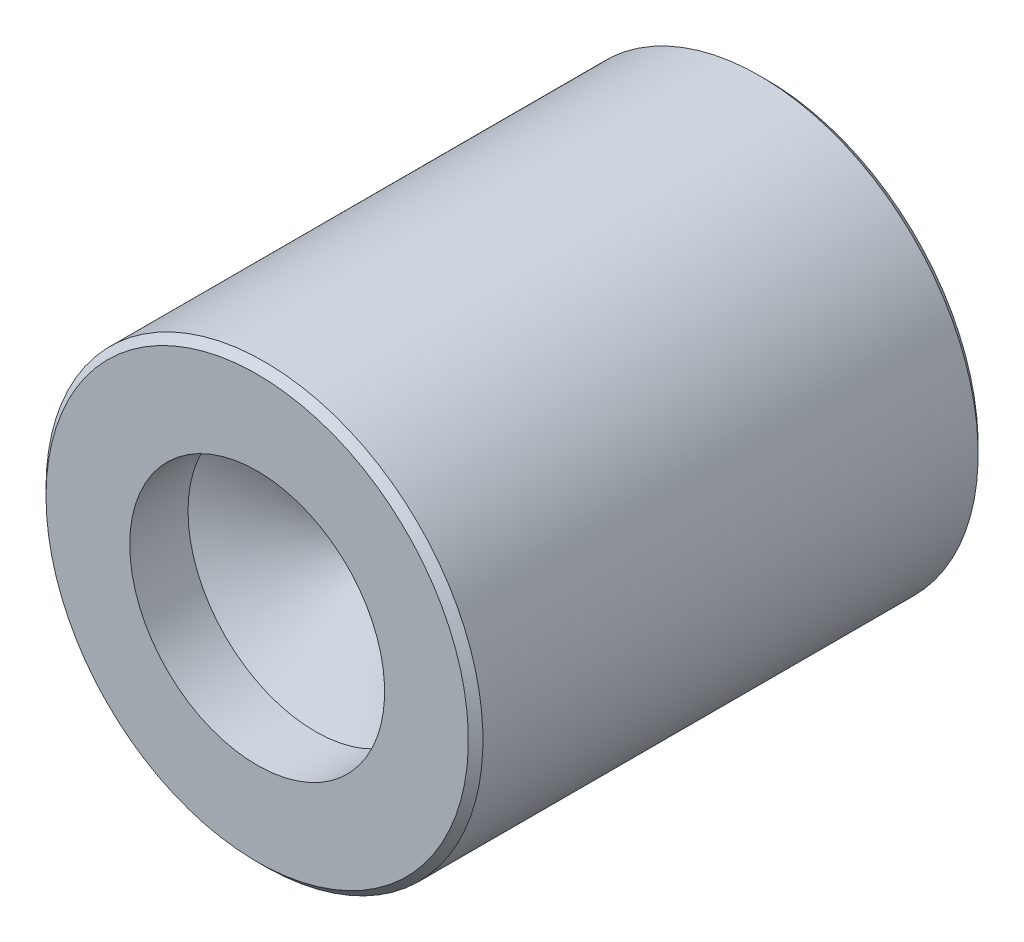
ISO-10303-21;
HEADER;
FILE_DESCRIPTION(('STEP AP214'),'2;1');
FILE_NAME('part.step','',(''),(''),'','','');
FILE_SCHEMA(('AUTOMOTIVE_DESIGN { 1 0 10303 214 1 1 1 1 }'));
ENDSEC;
DATA;
#1=APPLICATION_CONTEXT('core data for automotive mechanical design processes');
#2=APPLICATION_PROTOCOL_DEFINITION('international standard','automotive_design',2000,#1);
#3=PRODUCT_CONTEXT('',#1,'mechanical');
#4=PRODUCT('Part','Part','',(#3));
#5=PRODUCT_RELATED_PRODUCT_CATEGORY('part','',(#4));
#6=PRODUCT_DEFINITION_FORMATION('','',#4);
#7=PRODUCT_DEFINITION_CONTEXT('part definition',#1,'design');
#8=PRODUCT_DEFINITION('design','',#6,#7);
#9=PRODUCT_DEFINITION_SHAPE('','',#8);
#10=(LENGTH_UNIT() NAMED_UNIT(*) SI_UNIT(.MILLI.,.METRE.));
#11=(NAMED_UNIT(*) PLANE_ANGLE_UNIT() SI_UNIT($,.RADIAN.));
#12=(NAMED_UNIT(*) SI_UNIT($,.STERADIAN.) SOLID_ANGLE_UNIT());
#13=UNCERTAINTY_MEASURE_WITH_UNIT(LENGTH_MEASURE(1.E-05),#10,'distance_accuracy_value','');
#14=(GEOMETRIC_REPRESENTATION_CONTEXT(3) GLOBAL_UNCERTAINTY_ASSIGNED_CONTEXT((#13)) GLOBAL_UNIT_ASSIGNED_CONTEXT((#10,
#11,#12)) REPRESENTATION_CONTEXT('',''));
#15=CARTESIAN_POINT('',(0.,0.,0.));
#16=DIRECTION('',(0.,0.,1.));
#17=DIRECTION('',(1.,0.,0.));
#18=AXIS2_PLACEMENT_3D('',#15,#16,#17);
#19=CARTESIAN_POINT('',(0.,0.,67.0833333333376));
#20=DIRECTION('',(0.,0.,-1.));
#21=DIRECTION('',(-1.,0.,0.));
#22=AXIS2_PLACEMENT_3D('',#19,#20,#21);
#23=CYLINDRICAL_SURFACE('',#22,16.7708333333344);
#24=CARTESIAN_POINT('',(0.,0.,59.4166666666323));
#25=DIRECTION('',(0.,0.,-1.));
#26=DIRECTION('',(-1.,0.,0.));
#27=AXIS2_PLACEMENT_3D('',#24,#25,#26);
#28=CIRCLE('',#27,16.7708333333344);
#29=CARTESIAN_POINT('',(-16.7708333333344,0.,59.4166666666323));
#30=VERTEX_POINT('',#29);
#31=EDGE_CURVE('E11',#30,#30,#28,.T.);
#32=ORIENTED_EDGE('',*,*,#31,.T.);
#33=EDGE_LOOP('',(#32));
#34=FACE_BOUND('',#33,.T.);
#35=CARTESIAN_POINT('',(0.,0.,67.0833333333394));
#36=DIRECTION('',(0.,0.,-1.));
#37=DIRECTION('',(-1.,0.,0.));
#38=AXIS2_PLACEMENT_3D('',#35,#36,#37);
#39=CIRCLE('',#38,16.7708333333344);
#40=CARTESIAN_POINT('',(-16.7708333333344,0.,67.0833333333394));
#41=VERTEX_POINT('',#40);
#42=EDGE_CURVE('E52',#41,#41,#39,.T.);
#43=ORIENTED_EDGE('',*,*,#42,.F.);
#44=EDGE_LOOP('',(#43));
#45=FACE_BOUND('',#44,.T.);
#46=ADVANCED_FACE('F33',(#34,#45),#23,.F.);
#47=CARTESIAN_POINT('',(0.,0.,59.4166666666323));
#48=DIRECTION('',(0.,0.,1.));
#49=DIRECTION('',(1.,0.,0.));
#50=AXIS2_PLACEMENT_3D('',#47,#48,#49);
#51=CONICAL_SURFACE('',#50,16.7708333333344,1.02974425868);
#52=CARTESIAN_POINT('',(0.,0.,49.3397333684333));
#53=VERTEX_POINT('',#52);
#54=VERTEX_LOOP('',#53);
#55=FACE_BOUND('',#54,.T.);
#56=ORIENTED_EDGE('',*,*,#31,.F.);
#57=EDGE_LOOP('',(#56));
#58=FACE_BOUND('',#57,.T.);
#59=ADVANCED_FACE('F42',(#55,#58),#51,.F.);
#60=CARTESIAN_POINT('',(0.,0.,0.));
#61=DIRECTION('',(0.,0.,-1.));
#62=DIRECTION('',(-1.,0.,0.));
#63=AXIS2_PLACEMENT_3D('',#60,#61,#62);
#64=PLANE('',#63);
#65=CARTESIAN_POINT('',(0.,0.,0.));
#66=DIRECTION('',(0.,0.,-1.));
#67=DIRECTION('',(-1.,0.,0.));
#68=AXIS2_PLACEMENT_3D('',#65,#66,#67);
#69=CIRCLE('',#68,27.7916666666672);
#70=CARTESIAN_POINT('',(-27.7916666666672,0.,0.));
#71=VERTEX_POINT('',#70);
#72=EDGE_CURVE('E39',#71,#71,#69,.T.);
#73=ORIENTED_EDGE('',*,*,#72,.T.);
#74=EDGE_LOOP('',(#73));
#75=FACE_BOUND('',#74,.T.);
#76=ADVANCED_FACE('F45',(#75),#64,.T.);
#77=CARTESIAN_POINT('',(0.,0.,0.));
#78=DIRECTION('',(0.,0.,1.));
#79=DIRECTION('',(1.,0.,0.));
#80=AXIS2_PLACEMENT_3D('',#77,#78,#79);
#81=CONICAL_SURFACE('',#80,27.7916666666672,0.785398163397452);
#82=CARTESIAN_POINT('',(0.,0.,0.95833333333277));
#83=DIRECTION('',(0.,0.,-1.));
#84=DIRECTION('',(-1.,0.,0.));
#85=AXIS2_PLACEMENT_3D('',#82,#83,#84);
#86=CIRCLE('',#85,28.75);
#87=CARTESIAN_POINT('',(-28.75,0.,0.958333333332776));
#88=VERTEX_POINT('',#87);
#89=EDGE_CURVE('E62',#88,#88,#86,.T.);
#90=ORIENTED_EDGE('',*,*,#89,.T.);
#91=EDGE_LOOP('',(#90));
#92=FACE_BOUND('',#91,.T.);
#93=ORIENTED_EDGE('',*,*,#72,.F.);
#94=EDGE_LOOP('',(#93));
#95=FACE_BOUND('',#94,.T.);
#96=ADVANCED_FACE('F68',(#92,#95),#81,.T.);
#97=CARTESIAN_POINT('',(0.,0.,67.0833333333376));
#98=DIRECTION('',(0.,0.,-1.));
#99=DIRECTION('',(-1.,0.,0.));
#100=AXIS2_PLACEMENT_3D('',#97,#98,#99);
#101=CYLINDRICAL_SURFACE('',#100,28.75);
#102=CARTESIAN_POINT('',(0.,0.,66.125000000006));
#103=DIRECTION('',(0.,0.,-1.));
#104=DIRECTION('',(-1.,0.,0.));
#105=AXIS2_PLACEMENT_3D('',#102,#103,#104);
#106=CIRCLE('',#105,28.75);
#107=CARTESIAN_POINT('',(-28.75,0.,66.125000000006));
#108=VERTEX_POINT('',#107);
#109=EDGE_CURVE('E57',#108,#108,#106,.T.);
#110=ORIENTED_EDGE('',*,*,#109,.T.);
#111=EDGE_LOOP('',(#110));
#112=FACE_BOUND('',#111,.T.);
#113=ORIENTED_EDGE('',*,*,#89,.F.);
#114=EDGE_LOOP('',(#113));
#115=FACE_BOUND('',#114,.T.);
#116=ADVANCED_FACE('F70',(#112,#115),#101,.T.);
#117=CARTESIAN_POINT('',(0.,0.,66.125000000006));
#118=DIRECTION('',(0.,0.,-1.));
#119=DIRECTION('',(-1.,0.,0.));
#120=AXIS2_PLACEMENT_3D('',#117,#118,#119);
#121=CONICAL_SURFACE('',#120,28.75,0.78539816339745);
#122=CARTESIAN_POINT('',(0.,0.,67.0833333333394));
#123=DIRECTION('',(0.,0.,-1.));
#124=DIRECTION('',(-1.,0.,0.));
#125=AXIS2_PLACEMENT_3D('',#122,#123,#124);
#126=CIRCLE('',#125,27.7916666666666);
#127=CARTESIAN_POINT('',(-27.7916666666666,0.,67.0833333333394));
#128=VERTEX_POINT('',#127);
#129=EDGE_CURVE('E54',#128,#128,#126,.T.);
#130=ORIENTED_EDGE('',*,*,#129,.T.);
#131=EDGE_LOOP('',(#130));
#132=FACE_BOUND('',#131,.T.);
#133=ORIENTED_EDGE('',*,*,#109,.F.);
#134=EDGE_LOOP('',(#133));
#135=FACE_BOUND('',#134,.T.);
#136=ADVANCED_FACE('F77',(#132,#135),#121,.T.);
#137=CARTESIAN_POINT('',(27.7916666666666,0.,67.0833333333394));
#138=DIRECTION('',(0.,0.,1.));
#139=DIRECTION('',(1.,0.,0.));
#140=AXIS2_PLACEMENT_3D('',#137,#138,#139);
#141=PLANE('',#140);
#142=ORIENTED_EDGE('',*,*,#42,.T.);
#143=EDGE_LOOP('',(#142));
#144=FACE_BOUND('',#143,.T.);
#145=ORIENTED_EDGE('',*,*,#129,.F.);
#146=EDGE_LOOP('',(#145));
#147=FACE_BOUND('',#146,.T.);
#148=ADVANCED_FACE('F84',(#144,#147),#141,.T.);
#149=CLOSED_SHELL('',(#46,#59,#76,#96,#116,#136,#148));
#150=MANIFOLD_SOLID_BREP('B2',#149);
#151=ADVANCED_BREP_SHAPE_REPRESENTATION('',(#18,#150),#14);
#152=SHAPE_DEFINITION_REPRESENTATION(#9,#151);
ENDSEC;
END-ISO-10303-21;
